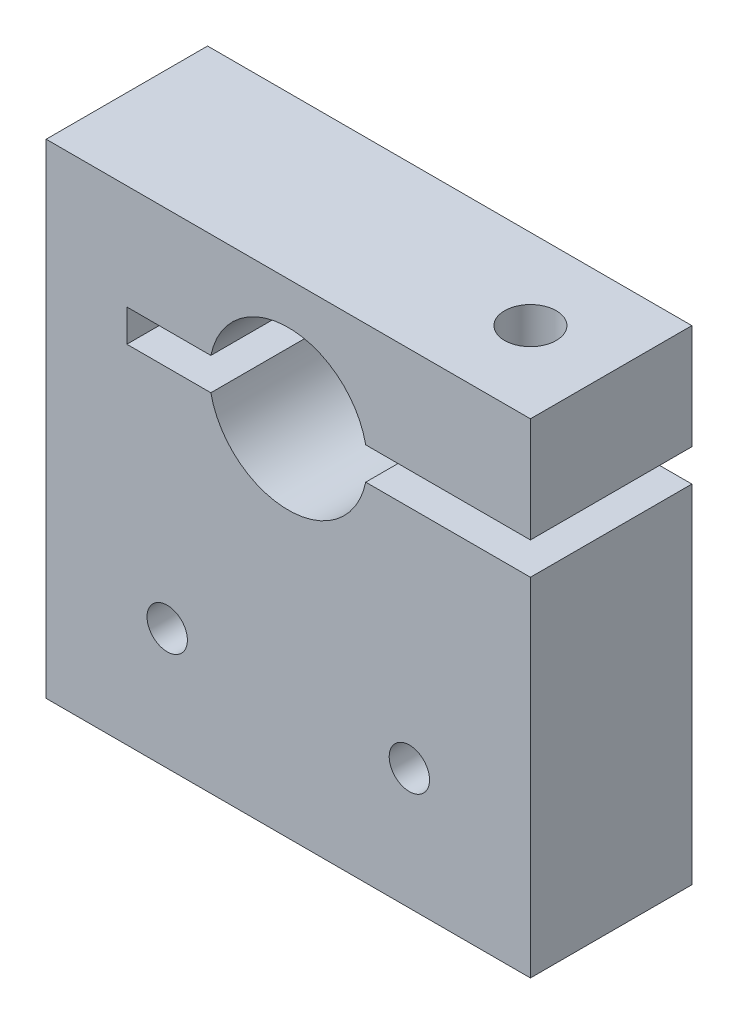
ISO-10303-21;
HEADER;
FILE_DESCRIPTION(('STEP AP214'),'2;1');
FILE_NAME('part.step','',(''),(''),'','','');
FILE_SCHEMA(('AUTOMOTIVE_DESIGN { 1 0 10303 214 1 1 1 1 }'));
ENDSEC;
DATA;
#1=APPLICATION_CONTEXT('core data for automotive mechanical design processes');
#2=APPLICATION_PROTOCOL_DEFINITION('international standard','automotive_design',2000,#1);
#3=PRODUCT_CONTEXT('',#1,'mechanical');
#4=PRODUCT('Part','Part','',(#3));
#5=PRODUCT_RELATED_PRODUCT_CATEGORY('part','',(#4));
#6=PRODUCT_DEFINITION_FORMATION('','',#4);
#7=PRODUCT_DEFINITION_CONTEXT('part definition',#1,'design');
#8=PRODUCT_DEFINITION('design','',#6,#7);
#9=PRODUCT_DEFINITION_SHAPE('','',#8);
#10=(LENGTH_UNIT() NAMED_UNIT(*) SI_UNIT(.MILLI.,.METRE.));
#11=(NAMED_UNIT(*) PLANE_ANGLE_UNIT() SI_UNIT($,.RADIAN.));
#12=(NAMED_UNIT(*) SI_UNIT($,.STERADIAN.) SOLID_ANGLE_UNIT());
#13=UNCERTAINTY_MEASURE_WITH_UNIT(LENGTH_MEASURE(1.E-05),#10,'distance_accuracy_value','');
#14=(GEOMETRIC_REPRESENTATION_CONTEXT(3) GLOBAL_UNCERTAINTY_ASSIGNED_CONTEXT((#13)) GLOBAL_UNIT_ASSIGNED_CONTEXT((#10,
#11,#12)) REPRESENTATION_CONTEXT('',''));
#15=CARTESIAN_POINT('',(0.,0.,0.));
#16=DIRECTION('',(0.,0.,1.));
#17=DIRECTION('',(1.,0.,0.));
#18=AXIS2_PLACEMENT_3D('',#15,#16,#17);
#19=CARTESIAN_POINT('',(-15.,15.,10.));
#20=DIRECTION('',(0.,-1.,0.));
#21=DIRECTION('',(0.,0.,-1.));
#22=AXIS2_PLACEMENT_3D('',#19,#20,#21);
#23=PLANE('',#22);
#24=DIRECTION('',(-1.,0.,0.));
#25=VECTOR('',#24,1.);
#26=CARTESIAN_POINT('',(-15.,15.,0.));
#27=LINE('',#26,#25);
#28=CARTESIAN_POINT('',(15.,15.,0.));
#29=VERTEX_POINT('',#28);
#30=CARTESIAN_POINT('',(-15.,15.,0.));
#31=VERTEX_POINT('',#30);
#32=EDGE_CURVE('E181',#29,#31,#27,.T.);
#33=ORIENTED_EDGE('',*,*,#32,.T.);
#34=DIRECTION('',(0.,0.,-1.));
#35=VECTOR('',#34,1.);
#36=CARTESIAN_POINT('',(-15.,15.,10.));
#37=LINE('',#36,#35);
#38=CARTESIAN_POINT('',(-15.,15.,10.));
#39=VERTEX_POINT('',#38);
#40=EDGE_CURVE('E192',#39,#31,#37,.T.);
#41=ORIENTED_EDGE('',*,*,#40,.F.);
#42=DIRECTION('',(-1.,0.,0.));
#43=VECTOR('',#42,1.);
#44=CARTESIAN_POINT('',(-15.,15.,10.));
#45=LINE('',#44,#43);
#46=CARTESIAN_POINT('',(15.,15.,10.));
#47=VERTEX_POINT('',#46);
#48=EDGE_CURVE('E170',#47,#39,#45,.T.);
#49=ORIENTED_EDGE('',*,*,#48,.F.);
#50=DIRECTION('',(0.,0.,-1.));
#51=VECTOR('',#50,1.);
#52=CARTESIAN_POINT('',(15.,15.,10.));
#53=LINE('',#52,#51);
#54=EDGE_CURVE('E195',#47,#29,#53,.T.);
#55=ORIENTED_EDGE('',*,*,#54,.T.);
#56=EDGE_LOOP('',(#33,#41,#49,#55));
#57=FACE_BOUND('',#56,.T.);
#58=CARTESIAN_POINT('',(10.,15.,5.));
#59=DIRECTION('',(0.,1.,0.));
#60=DIRECTION('',(0.,0.,1.));
#61=AXIS2_PLACEMENT_3D('',#58,#59,#60);
#62=CIRCLE('',#61,1.6);
#63=CARTESIAN_POINT('',(10.,15.,6.6));
#64=VERTEX_POINT('',#63);
#65=EDGE_CURVE('E117',#64,#64,#62,.T.);
#66=ORIENTED_EDGE('',*,*,#65,.F.);
#67=EDGE_LOOP('',(#66));
#68=FACE_BOUND('',#67,.T.);
#69=ADVANCED_FACE('F17',(#57,#68),#23,.F.);
#70=CARTESIAN_POINT('',(15.,15.,10.));
#71=DIRECTION('',(-1.,0.,0.));
#72=DIRECTION('',(0.,-1.,0.));
#73=AXIS2_PLACEMENT_3D('',#70,#71,#72);
#74=PLANE('',#73);
#75=DIRECTION('',(0.,1.,0.));
#76=VECTOR('',#75,1.);
#77=CARTESIAN_POINT('',(15.,15.,0.));
#78=LINE('',#77,#76);
#79=CARTESIAN_POINT('',(15.,-15.,0.));
#80=VERTEX_POINT('',#79);
#81=CARTESIAN_POINT('',(15.,6.5,0.));
#82=VERTEX_POINT('',#81);
#83=EDGE_CURVE('E178',#80,#82,#78,.T.);
#84=ORIENTED_EDGE('',*,*,#83,.T.);
#85=DIRECTION('',(0.,0.,-1.));
#86=VECTOR('',#85,1.);
#87=CARTESIAN_POINT('',(15.,6.5,10.));
#88=LINE('',#87,#86);
#89=CARTESIAN_POINT('',(15.,6.5,10.));
#90=VERTEX_POINT('',#89);
#91=EDGE_CURVE('E153',#90,#82,#88,.T.);
#92=ORIENTED_EDGE('',*,*,#91,.F.);
#93=DIRECTION('',(0.,1.,0.));
#94=VECTOR('',#93,1.);
#95=CARTESIAN_POINT('',(15.,15.,10.));
#96=LINE('',#95,#94);
#97=CARTESIAN_POINT('',(15.,-15.,10.));
#98=VERTEX_POINT('',#97);
#99=EDGE_CURVE('E167',#98,#90,#96,.T.);
#100=ORIENTED_EDGE('',*,*,#99,.F.);
#101=DIRECTION('',(0.,0.,-1.));
#102=VECTOR('',#101,1.);
#103=CARTESIAN_POINT('',(15.,-15.,10.));
#104=LINE('',#103,#102);
#105=EDGE_CURVE('E177',#98,#80,#104,.T.);
#106=ORIENTED_EDGE('',*,*,#105,.T.);
#107=EDGE_LOOP('',(#84,#92,#100,#106));
#108=FACE_BOUND('',#107,.T.);
#109=ADVANCED_FACE('F226',(#108),#74,.F.);
#110=CARTESIAN_POINT('',(0.,7.5,0.));
#111=DIRECTION('',(0.,0.,-1.));
#112=DIRECTION('',(-1.,0.,0.));
#113=AXIS2_PLACEMENT_3D('',#110,#111,#112);
#114=CYLINDRICAL_SURFACE('',#113,4.9);
#115=CARTESIAN_POINT('',(0.,7.5,0.));
#116=DIRECTION('',(0.,0.,-1.));
#117=DIRECTION('',(-1.,0.,0.));
#118=AXIS2_PLACEMENT_3D('',#115,#116,#117);
#119=CIRCLE('',#118,4.9);
#120=CARTESIAN_POINT('',(4.79687398208458,6.5,0.));
#121=VERTEX_POINT('',#120);
#122=CARTESIAN_POINT('',(-4.79687398208458,6.5,0.));
#123=VERTEX_POINT('',#122);
#124=EDGE_CURVE('E152',#121,#123,#119,.T.);
#125=ORIENTED_EDGE('',*,*,#124,.T.);
#126=DIRECTION('',(0.,0.,-1.));
#127=VECTOR('',#126,1.);
#128=CARTESIAN_POINT('',(-4.79687398208458,6.5,0.));
#129=LINE('',#128,#127);
#130=CARTESIAN_POINT('',(-4.79687398208458,6.5,10.));
#131=VERTEX_POINT('',#130);
#132=EDGE_CURVE('E11',#123,#131,#129,.F.);
#133=ORIENTED_EDGE('',*,*,#132,.T.);
#134=CARTESIAN_POINT('',(0.,7.5,10.));
#135=DIRECTION('',(0.,0.,-1.));
#136=DIRECTION('',(-1.,0.,0.));
#137=AXIS2_PLACEMENT_3D('',#134,#135,#136);
#138=CIRCLE('',#137,4.9);
#139=CARTESIAN_POINT('',(4.79687398208458,6.5,10.));
#140=VERTEX_POINT('',#139);
#141=EDGE_CURVE('E162',#140,#131,#138,.T.);
#142=ORIENTED_EDGE('',*,*,#141,.F.);
#143=DIRECTION('',(0.,0.,-1.));
#144=VECTOR('',#143,1.);
#145=CARTESIAN_POINT('',(4.79687398208458,6.5,0.));
#146=LINE('',#145,#144);
#147=EDGE_CURVE('E25',#140,#121,#146,.T.);
#148=ORIENTED_EDGE('',*,*,#147,.T.);
#149=EDGE_LOOP('',(#125,#133,#142,#148));
#150=FACE_BOUND('',#149,.T.);
#151=ADVANCED_FACE('F206',(#150),#114,.F.);
#152=CARTESIAN_POINT('',(15.,8.5,10.));
#153=VERTEX_POINT('',#152);
#154=EDGE_CURVE('E171',#153,#47,#96,.T.);
#155=ORIENTED_EDGE('',*,*,#154,.F.);
#156=DIRECTION('',(0.,0.,-1.));
#157=VECTOR('',#156,1.);
#158=CARTESIAN_POINT('',(15.,8.5,10.));
#159=LINE('',#158,#157);
#160=CARTESIAN_POINT('',(15.,8.5,0.));
#161=VERTEX_POINT('',#160);
#162=EDGE_CURVE('E155',#153,#161,#159,.T.);
#163=ORIENTED_EDGE('',*,*,#162,.T.);
#164=EDGE_CURVE('E166',#161,#29,#78,.T.);
#165=ORIENTED_EDGE('',*,*,#164,.T.);
#166=ORIENTED_EDGE('',*,*,#54,.F.);
#167=EDGE_LOOP('',(#155,#163,#165,#166));
#168=FACE_BOUND('',#167,.T.);
#169=ADVANCED_FACE('F19',(#168),#74,.F.);
#170=CARTESIAN_POINT('',(-15.,15.,10.));
#171=DIRECTION('',(1.,0.,0.));
#172=DIRECTION('',(0.,1.,0.));
#173=AXIS2_PLACEMENT_3D('',#170,#171,#172);
#174=PLANE('',#173);
#175=DIRECTION('',(0.,-1.,0.));
#176=VECTOR('',#175,1.);
#177=CARTESIAN_POINT('',(-15.,15.,0.));
#178=LINE('',#177,#176);
#179=CARTESIAN_POINT('',(-15.,-15.,0.));
#180=VERTEX_POINT('',#179);
#181=EDGE_CURVE('E183',#31,#180,#178,.T.);
#182=ORIENTED_EDGE('',*,*,#181,.T.);
#183=DIRECTION('',(0.,0.,-1.));
#184=VECTOR('',#183,1.);
#185=CARTESIAN_POINT('',(-15.,-15.,10.));
#186=LINE('',#185,#184);
#187=CARTESIAN_POINT('',(-15.,-15.,10.));
#188=VERTEX_POINT('',#187);
#189=EDGE_CURVE('E189',#188,#180,#186,.T.);
#190=ORIENTED_EDGE('',*,*,#189,.F.);
#191=DIRECTION('',(0.,-1.,0.));
#192=VECTOR('',#191,1.);
#193=CARTESIAN_POINT('',(-15.,15.,10.));
#194=LINE('',#193,#192);
#195=EDGE_CURVE('E173',#39,#188,#194,.T.);
#196=ORIENTED_EDGE('',*,*,#195,.F.);
#197=ORIENTED_EDGE('',*,*,#40,.T.);
#198=EDGE_LOOP('',(#182,#190,#196,#197));
#199=FACE_BOUND('',#198,.T.);
#200=ADVANCED_FACE('F237',(#199),#174,.F.);
#201=CARTESIAN_POINT('',(-15.,-15.,10.));
#202=DIRECTION('',(0.,1.,0.));
#203=DIRECTION('',(0.,0.,1.));
#204=AXIS2_PLACEMENT_3D('',#201,#202,#203);
#205=PLANE('',#204);
#206=DIRECTION('',(1.,0.,0.));
#207=VECTOR('',#206,1.);
#208=CARTESIAN_POINT('',(-15.,-15.,0.));
#209=LINE('',#208,#207);
#210=EDGE_CURVE('E185',#180,#80,#209,.T.);
#211=ORIENTED_EDGE('',*,*,#210,.T.);
#212=ORIENTED_EDGE('',*,*,#105,.F.);
#213=DIRECTION('',(1.,0.,0.));
#214=VECTOR('',#213,1.);
#215=CARTESIAN_POINT('',(-15.,-15.,10.));
#216=LINE('',#215,#214);
#217=EDGE_CURVE('E175',#188,#98,#216,.T.);
#218=ORIENTED_EDGE('',*,*,#217,.F.);
#219=ORIENTED_EDGE('',*,*,#189,.T.);
#220=EDGE_LOOP('',(#211,#212,#218,#219));
#221=FACE_BOUND('',#220,.T.);
#222=ADVANCED_FACE('F232',(#221),#205,.F.);
#223=CARTESIAN_POINT('',(0.,0.,10.));
#224=DIRECTION('',(0.,0.,1.));
#225=DIRECTION('',(1.,0.,0.));
#226=AXIS2_PLACEMENT_3D('',#223,#224,#225);
#227=PLANE('',#226);
#228=CARTESIAN_POINT('',(7.5,-7.5,10.));
#229=DIRECTION('',(0.,0.,-1.));
#230=DIRECTION('',(-1.,0.,0.));
#231=AXIS2_PLACEMENT_3D('',#228,#229,#230);
#232=CIRCLE('',#231,1.25);
#233=CARTESIAN_POINT('',(6.25,-7.5,10.));
#234=VERTEX_POINT('',#233);
#235=EDGE_CURVE('E443',#234,#234,#232,.T.);
#236=ORIENTED_EDGE('',*,*,#235,.T.);
#237=EDGE_LOOP('',(#236));
#238=FACE_BOUND('',#237,.T.);
#239=CARTESIAN_POINT('',(-7.5,-7.5,10.));
#240=DIRECTION('',(0.,0.,-1.));
#241=DIRECTION('',(-1.,0.,0.));
#242=AXIS2_PLACEMENT_3D('',#239,#240,#241);
#243=CIRCLE('',#242,1.25);
#244=CARTESIAN_POINT('',(-8.75,-7.5,10.));
#245=VERTEX_POINT('',#244);
#246=EDGE_CURVE('E124',#245,#245,#243,.T.);
#247=ORIENTED_EDGE('',*,*,#246,.T.);
#248=EDGE_LOOP('',(#247));
#249=FACE_BOUND('',#248,.T.);
#250=DIRECTION('',(-1.,0.,0.));
#251=VECTOR('',#250,1.);
#252=CARTESIAN_POINT('',(15.,6.5,10.));
#253=LINE('',#252,#251);
#254=EDGE_CURVE('E139',#90,#140,#253,.T.);
#255=ORIENTED_EDGE('',*,*,#254,.T.);
#256=ORIENTED_EDGE('',*,*,#141,.T.);
#257=CARTESIAN_POINT('',(-10.,6.5,10.));
#258=VERTEX_POINT('',#257);
#259=EDGE_CURVE('E138',#131,#258,#253,.T.);
#260=ORIENTED_EDGE('',*,*,#259,.T.);
#261=DIRECTION('',(0.,1.,0.));
#262=VECTOR('',#261,1.);
#263=CARTESIAN_POINT('',(-10.,8.5,10.));
#264=LINE('',#263,#262);
#265=CARTESIAN_POINT('',(-10.,8.5,10.));
#266=VERTEX_POINT('',#265);
#267=EDGE_CURVE('E131',#258,#266,#264,.T.);
#268=ORIENTED_EDGE('',*,*,#267,.T.);
#269=DIRECTION('',(1.,0.,0.));
#270=VECTOR('',#269,1.);
#271=CARTESIAN_POINT('',(15.,8.5,10.));
#272=LINE('',#271,#270);
#273=CARTESIAN_POINT('',(-4.79687398208458,8.5,10.));
#274=VERTEX_POINT('',#273);
#275=EDGE_CURVE('E135',#266,#274,#272,.T.);
#276=ORIENTED_EDGE('',*,*,#275,.T.);
#277=CARTESIAN_POINT('',(4.79687398208458,8.5,10.));
#278=VERTEX_POINT('',#277);
#279=EDGE_CURVE('E163',#274,#278,#138,.T.);
#280=ORIENTED_EDGE('',*,*,#279,.T.);
#281=EDGE_CURVE('E134',#278,#153,#272,.T.);
#282=ORIENTED_EDGE('',*,*,#281,.T.);
#283=ORIENTED_EDGE('',*,*,#154,.T.);
#284=ORIENTED_EDGE('',*,*,#48,.T.);
#285=ORIENTED_EDGE('',*,*,#195,.T.);
#286=ORIENTED_EDGE('',*,*,#217,.T.);
#287=ORIENTED_EDGE('',*,*,#99,.T.);
#288=EDGE_LOOP('',(#255,#256,#260,#268,#276,#280,#282,#283,#284,#285,#286,#287));
#289=FACE_BOUND('',#288,.T.);
#290=ADVANCED_FACE('F221',(#238,#249,#289),#227,.T.);
#291=CARTESIAN_POINT('',(0.,0.,0.));
#292=DIRECTION('',(0.,0.,1.));
#293=DIRECTION('',(1.,0.,0.));
#294=AXIS2_PLACEMENT_3D('',#291,#292,#293);
#295=PLANE('',#294);
#296=CARTESIAN_POINT('',(7.5,-7.5,0.));
#297=DIRECTION('',(0.,0.,-1.));
#298=DIRECTION('',(-1.,0.,0.));
#299=AXIS2_PLACEMENT_3D('',#296,#297,#298);
#300=CIRCLE('',#299,1.25);
#301=CARTESIAN_POINT('',(6.25,-7.5,0.));
#302=VERTEX_POINT('',#301);
#303=EDGE_CURVE('E446',#302,#302,#300,.T.);
#304=ORIENTED_EDGE('',*,*,#303,.F.);
#305=EDGE_LOOP('',(#304));
#306=FACE_BOUND('',#305,.T.);
#307=CARTESIAN_POINT('',(-7.5,-7.5,0.));
#308=DIRECTION('',(0.,0.,-1.));
#309=DIRECTION('',(-1.,0.,0.));
#310=AXIS2_PLACEMENT_3D('',#307,#308,#309);
#311=CIRCLE('',#310,1.25);
#312=CARTESIAN_POINT('',(-8.75,-7.5,0.));
#313=VERTEX_POINT('',#312);
#314=EDGE_CURVE('E448',#313,#313,#311,.T.);
#315=ORIENTED_EDGE('',*,*,#314,.F.);
#316=EDGE_LOOP('',(#315));
#317=FACE_BOUND('',#316,.T.);
#318=ORIENTED_EDGE('',*,*,#124,.F.);
#319=DIRECTION('',(-1.,0.,0.));
#320=VECTOR('',#319,1.);
#321=CARTESIAN_POINT('',(15.,6.5,0.));
#322=LINE('',#321,#320);
#323=EDGE_CURVE('E32',#82,#121,#322,.T.);
#324=ORIENTED_EDGE('',*,*,#323,.F.);
#325=ORIENTED_EDGE('',*,*,#83,.F.);
#326=ORIENTED_EDGE('',*,*,#210,.F.);
#327=ORIENTED_EDGE('',*,*,#181,.F.);
#328=ORIENTED_EDGE('',*,*,#32,.F.);
#329=ORIENTED_EDGE('',*,*,#164,.F.);
#330=DIRECTION('',(1.,0.,0.));
#331=VECTOR('',#330,1.);
#332=CARTESIAN_POINT('',(15.,8.5,0.));
#333=LINE('',#332,#331);
#334=CARTESIAN_POINT('',(4.79687398208458,8.5,0.));
#335=VERTEX_POINT('',#334);
#336=EDGE_CURVE('E145',#335,#161,#333,.T.);
#337=ORIENTED_EDGE('',*,*,#336,.F.);
#338=CARTESIAN_POINT('',(-4.79687398208458,8.5,0.));
#339=VERTEX_POINT('',#338);
#340=EDGE_CURVE('E159',#339,#335,#119,.T.);
#341=ORIENTED_EDGE('',*,*,#340,.F.);
#342=CARTESIAN_POINT('',(-10.,8.5,0.));
#343=VERTEX_POINT('',#342);
#344=EDGE_CURVE('E40',#343,#339,#333,.T.);
#345=ORIENTED_EDGE('',*,*,#344,.F.);
#346=DIRECTION('',(0.,1.,0.));
#347=VECTOR('',#346,1.);
#348=CARTESIAN_POINT('',(-10.,8.5,0.));
#349=LINE('',#348,#347);
#350=CARTESIAN_POINT('',(-10.,6.5,0.));
#351=VERTEX_POINT('',#350);
#352=EDGE_CURVE('E130',#351,#343,#349,.T.);
#353=ORIENTED_EDGE('',*,*,#352,.F.);
#354=EDGE_CURVE('E147',#123,#351,#322,.T.);
#355=ORIENTED_EDGE('',*,*,#354,.F.);
#356=EDGE_LOOP('',(#318,#324,#325,#326,#327,#328,#329,#337,#341,#345,#353,#355));
#357=FACE_BOUND('',#356,.T.);
#358=ADVANCED_FACE('F210',(#306,#317,#357),#295,.F.);
#359=ORIENTED_EDGE('',*,*,#340,.T.);
#360=DIRECTION('',(0.,0.,-1.));
#361=VECTOR('',#360,1.);
#362=CARTESIAN_POINT('',(4.79687398208458,8.5,0.));
#363=LINE('',#362,#361);
#364=EDGE_CURVE('E200',#335,#278,#363,.F.);
#365=ORIENTED_EDGE('',*,*,#364,.T.);
#366=ORIENTED_EDGE('',*,*,#279,.F.);
#367=DIRECTION('',(0.,0.,-1.));
#368=VECTOR('',#367,1.);
#369=CARTESIAN_POINT('',(-4.79687398208458,8.5,0.));
#370=LINE('',#369,#368);
#371=EDGE_CURVE('E198',#274,#339,#370,.T.);
#372=ORIENTED_EDGE('',*,*,#371,.T.);
#373=EDGE_LOOP('',(#359,#365,#366,#372));
#374=FACE_BOUND('',#373,.T.);
#375=ADVANCED_FACE('F253',(#374),#114,.F.);
#376=CARTESIAN_POINT('',(15.,8.5,10.));
#377=DIRECTION('',(0.,1.,0.));
#378=DIRECTION('',(-1.,0.,0.));
#379=AXIS2_PLACEMENT_3D('',#376,#377,#378);
#380=PLANE('',#379);
#381=ORIENTED_EDGE('',*,*,#275,.F.);
#382=DIRECTION('',(0.,0.,-1.));
#383=VECTOR('',#382,1.);
#384=CARTESIAN_POINT('',(-10.,8.5,10.));
#385=LINE('',#384,#383);
#386=EDGE_CURVE('E142',#266,#343,#385,.T.);
#387=ORIENTED_EDGE('',*,*,#386,.T.);
#388=ORIENTED_EDGE('',*,*,#344,.T.);
#389=ORIENTED_EDGE('',*,*,#371,.F.);
#390=EDGE_LOOP('',(#381,#387,#388,#389));
#391=FACE_BOUND('',#390,.T.);
#392=ADVANCED_FACE('F254',(#391),#380,.F.);
#393=CARTESIAN_POINT('',(15.,6.5,10.));
#394=DIRECTION('',(0.,-1.,0.));
#395=DIRECTION('',(1.,0.,0.));
#396=AXIS2_PLACEMENT_3D('',#393,#394,#395);
#397=PLANE('',#396);
#398=ORIENTED_EDGE('',*,*,#354,.T.);
#399=DIRECTION('',(0.,0.,-1.));
#400=VECTOR('',#399,1.);
#401=CARTESIAN_POINT('',(-10.,6.5,10.));
#402=LINE('',#401,#400);
#403=EDGE_CURVE('E149',#258,#351,#402,.T.);
#404=ORIENTED_EDGE('',*,*,#403,.F.);
#405=ORIENTED_EDGE('',*,*,#259,.F.);
#406=ORIENTED_EDGE('',*,*,#132,.F.);
#407=EDGE_LOOP('',(#398,#404,#405,#406));
#408=FACE_BOUND('',#407,.T.);
#409=ADVANCED_FACE('F214',(#408),#397,.F.);
#410=CARTESIAN_POINT('',(-10.,8.5,10.));
#411=DIRECTION('',(-1.,0.,0.));
#412=DIRECTION('',(0.,-1.,0.));
#413=AXIS2_PLACEMENT_3D('',#410,#411,#412);
#414=PLANE('',#413);
#415=ORIENTED_EDGE('',*,*,#352,.T.);
#416=ORIENTED_EDGE('',*,*,#386,.F.);
#417=ORIENTED_EDGE('',*,*,#267,.F.);
#418=ORIENTED_EDGE('',*,*,#403,.T.);
#419=EDGE_LOOP('',(#415,#416,#417,#418));
#420=FACE_BOUND('',#419,.T.);
#421=ADVANCED_FACE('F217',(#420),#414,.F.);
#422=CARTESIAN_POINT('',(10.,8.5,5.));
#423=DIRECTION('',(0.,1.,0.));
#424=DIRECTION('',(-1.,0.,0.));
#425=AXIS2_PLACEMENT_3D('',#422,#423,#424);
#426=CIRCLE('',#425,1.6);
#427=CARTESIAN_POINT('',(8.4,8.5,5.));
#428=VERTEX_POINT('',#427);
#429=EDGE_CURVE('E121',#428,#428,#426,.T.);
#430=ORIENTED_EDGE('',*,*,#429,.T.);
#431=EDGE_LOOP('',(#430));
#432=FACE_BOUND('',#431,.T.);
#433=ORIENTED_EDGE('',*,*,#336,.T.);
#434=ORIENTED_EDGE('',*,*,#162,.F.);
#435=ORIENTED_EDGE('',*,*,#281,.F.);
#436=ORIENTED_EDGE('',*,*,#364,.F.);
#437=EDGE_LOOP('',(#433,#434,#435,#436));
#438=FACE_BOUND('',#437,.T.);
#439=ADVANCED_FACE('F250',(#432,#438),#380,.F.);
#440=CARTESIAN_POINT('',(10.,6.5,5.));
#441=DIRECTION('',(0.,1.,0.));
#442=DIRECTION('',(0.,0.,1.));
#443=AXIS2_PLACEMENT_3D('',#440,#441,#442);
#444=CIRCLE('',#443,1.25);
#445=CARTESIAN_POINT('',(10.,6.5,6.25));
#446=VERTEX_POINT('',#445);
#447=EDGE_CURVE('E118',#446,#446,#444,.T.);
#448=ORIENTED_EDGE('',*,*,#447,.F.);
#449=EDGE_LOOP('',(#448));
#450=FACE_BOUND('',#449,.T.);
#451=ORIENTED_EDGE('',*,*,#254,.F.);
#452=ORIENTED_EDGE('',*,*,#91,.T.);
#453=ORIENTED_EDGE('',*,*,#323,.T.);
#454=ORIENTED_EDGE('',*,*,#147,.F.);
#455=EDGE_LOOP('',(#451,#452,#453,#454));
#456=FACE_BOUND('',#455,.T.);
#457=ADVANCED_FACE('F224',(#450,#456),#397,.F.);
#458=CARTESIAN_POINT('',(10.,15.,5.));
#459=DIRECTION('',(0.,1.,0.));
#460=DIRECTION('',(0.,0.,1.));
#461=AXIS2_PLACEMENT_3D('',#458,#459,#460);
#462=CYLINDRICAL_SURFACE('',#461,1.6);
#463=ORIENTED_EDGE('',*,*,#429,.F.);
#464=EDGE_LOOP('',(#463));
#465=FACE_BOUND('',#464,.T.);
#466=ORIENTED_EDGE('',*,*,#65,.T.);
#467=EDGE_LOOP('',(#466));
#468=FACE_BOUND('',#467,.T.);
#469=ADVANCED_FACE('F111',(#465,#468),#462,.F.);
#470=CARTESIAN_POINT('',(10.,-1.,5.));
#471=DIRECTION('',(0.,1.,0.));
#472=DIRECTION('',(0.,0.,1.));
#473=AXIS2_PLACEMENT_3D('',#470,#471,#472);
#474=CONICAL_SURFACE('',#473,1.25,1.02974425867665);
#475=CARTESIAN_POINT('',(10.,-1.75107577378445,5.));
#476=VERTEX_POINT('',#475);
#477=VERTEX_LOOP('',#476);
#478=FACE_BOUND('',#477,.T.);
#479=CARTESIAN_POINT('',(10.,-1.,5.));
#480=DIRECTION('',(0.,1.,0.));
#481=DIRECTION('',(0.,0.,1.));
#482=AXIS2_PLACEMENT_3D('',#479,#480,#481);
#483=CIRCLE('',#482,1.25);
#484=CARTESIAN_POINT('',(10.,-1.,6.25));
#485=VERTEX_POINT('',#484);
#486=EDGE_CURVE('E115',#485,#485,#483,.T.);
#487=ORIENTED_EDGE('',*,*,#486,.T.);
#488=EDGE_LOOP('',(#487));
#489=FACE_BOUND('',#488,.T.);
#490=ADVANCED_FACE('F107',(#478,#489),#474,.F.);
#491=CARTESIAN_POINT('',(10.,6.5,5.));
#492=DIRECTION('',(0.,1.,0.));
#493=DIRECTION('',(0.,0.,1.));
#494=AXIS2_PLACEMENT_3D('',#491,#492,#493);
#495=CYLINDRICAL_SURFACE('',#494,1.25);
#496=ORIENTED_EDGE('',*,*,#486,.F.);
#497=EDGE_LOOP('',(#496));
#498=FACE_BOUND('',#497,.T.);
#499=ORIENTED_EDGE('',*,*,#447,.T.);
#500=EDGE_LOOP('',(#499));
#501=FACE_BOUND('',#500,.T.);
#502=ADVANCED_FACE('F110',(#498,#501),#495,.F.);
#503=CARTESIAN_POINT('',(-7.5,-7.5,0.));
#504=DIRECTION('',(0.,0.,-1.));
#505=DIRECTION('',(-1.,0.,0.));
#506=AXIS2_PLACEMENT_3D('',#503,#504,#505);
#507=CYLINDRICAL_SURFACE('',#506,1.25);
#508=ORIENTED_EDGE('',*,*,#246,.F.);
#509=EDGE_LOOP('',(#508));
#510=FACE_BOUND('',#509,.T.);
#511=ORIENTED_EDGE('',*,*,#314,.T.);
#512=EDGE_LOOP('',(#511));
#513=FACE_BOUND('',#512,.T.);
#514=ADVANCED_FACE('F329',(#510,#513),#507,.F.);
#515=CARTESIAN_POINT('',(7.5,-7.5,0.));
#516=DIRECTION('',(0.,0.,-1.));
#517=DIRECTION('',(-1.,0.,0.));
#518=AXIS2_PLACEMENT_3D('',#515,#516,#517);
#519=CYLINDRICAL_SURFACE('',#518,1.25);
#520=ORIENTED_EDGE('',*,*,#235,.F.);
#521=EDGE_LOOP('',(#520));
#522=FACE_BOUND('',#521,.T.);
#523=ORIENTED_EDGE('',*,*,#303,.T.);
#524=EDGE_LOOP('',(#523));
#525=FACE_BOUND('',#524,.T.);
#526=ADVANCED_FACE('F342',(#522,#525),#519,.F.);
#527=CLOSED_SHELL('',(#69,#109,#151,#169,#200,#222,#290,#358,#375,#392,#409,#421,#439,#457,#469,
#490,#502,#514,#526));
#528=MANIFOLD_SOLID_BREP('B1',#527);
#529=ADVANCED_BREP_SHAPE_REPRESENTATION('',(#18,#528),#14);
#530=SHAPE_DEFINITION_REPRESENTATION(#9,#529);
ENDSEC;
END-ISO-10303-21;
